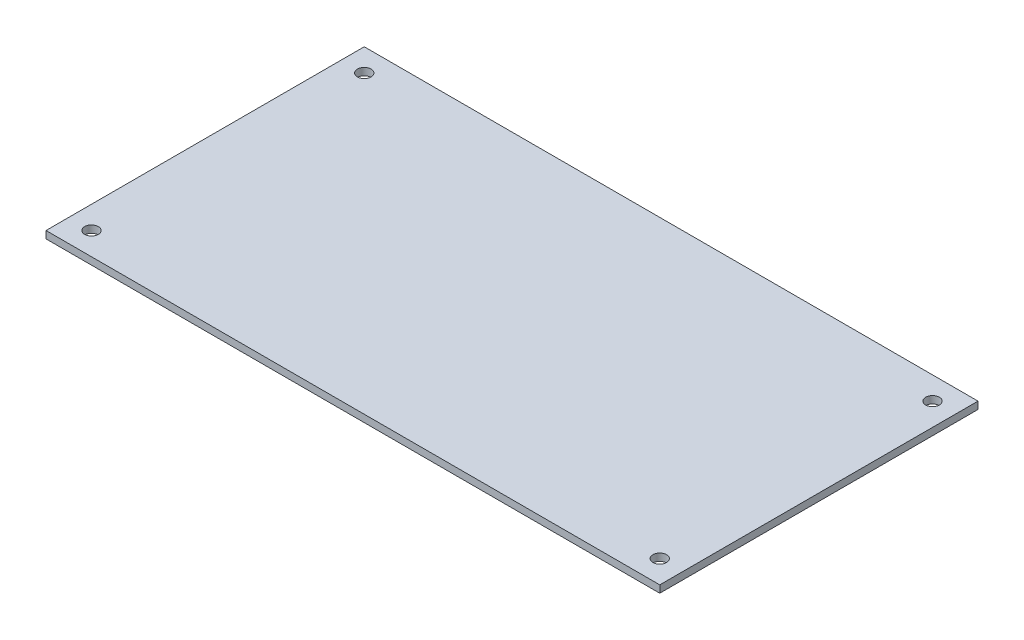
ISO-10303-21;
HEADER;
FILE_DESCRIPTION(('STEP AP214'),'2;1');
FILE_NAME('part.step','',(''),(''),'','','');
FILE_SCHEMA(('AUTOMOTIVE_DESIGN { 1 0 10303 214 1 1 1 1 }'));
ENDSEC;
DATA;
#1=APPLICATION_CONTEXT('core data for automotive mechanical design processes');
#2=APPLICATION_PROTOCOL_DEFINITION('international standard','automotive_design',2000,#1);
#3=PRODUCT_CONTEXT('',#1,'mechanical');
#4=PRODUCT('Part','Part','',(#3));
#5=PRODUCT_RELATED_PRODUCT_CATEGORY('part','',(#4));
#6=PRODUCT_DEFINITION_FORMATION('','',#4);
#7=PRODUCT_DEFINITION_CONTEXT('part definition',#1,'design');
#8=PRODUCT_DEFINITION('design','',#6,#7);
#9=PRODUCT_DEFINITION_SHAPE('','',#8);
#10=(LENGTH_UNIT() NAMED_UNIT(*) SI_UNIT(.MILLI.,.METRE.));
#11=(NAMED_UNIT(*) PLANE_ANGLE_UNIT() SI_UNIT($,.RADIAN.));
#12=(NAMED_UNIT(*) SI_UNIT($,.STERADIAN.) SOLID_ANGLE_UNIT());
#13=UNCERTAINTY_MEASURE_WITH_UNIT(LENGTH_MEASURE(1.E-05),#10,'distance_accuracy_value','');
#14=(GEOMETRIC_REPRESENTATION_CONTEXT(3) GLOBAL_UNCERTAINTY_ASSIGNED_CONTEXT((#13)) GLOBAL_UNIT_ASSIGNED_CONTEXT((#10,
#11,#12)) REPRESENTATION_CONTEXT('',''));
#15=CARTESIAN_POINT('',(0.,0.,0.));
#16=DIRECTION('',(0.,0.,1.));
#17=DIRECTION('',(1.,0.,0.));
#18=AXIS2_PLACEMENT_3D('',#15,#16,#17);
#19=CARTESIAN_POINT('',(67.5,1.6,35.));
#20=DIRECTION('',(-1.,0.,0.));
#21=DIRECTION('',(0.,0.,1.));
#22=AXIS2_PLACEMENT_3D('',#19,#20,#21);
#23=PLANE('',#22);
#24=DIRECTION('',(0.,0.,-1.));
#25=VECTOR('',#24,1.);
#26=CARTESIAN_POINT('',(67.5,0.,35.));
#27=LINE('',#26,#25);
#28=CARTESIAN_POINT('',(67.5,0.,35.));
#29=VERTEX_POINT('',#28);
#30=CARTESIAN_POINT('',(67.5,0.,-35.));
#31=VERTEX_POINT('',#30);
#32=EDGE_CURVE('E107',#29,#31,#27,.T.);
#33=ORIENTED_EDGE('',*,*,#32,.T.);
#34=DIRECTION('',(0.,-1.,0.));
#35=VECTOR('',#34,1.);
#36=CARTESIAN_POINT('',(67.5,1.6,-35.));
#37=LINE('',#36,#35);
#38=CARTESIAN_POINT('',(67.5,1.6,-35.));
#39=VERTEX_POINT('',#38);
#40=EDGE_CURVE('E11',#39,#31,#37,.T.);
#41=ORIENTED_EDGE('',*,*,#40,.F.);
#42=DIRECTION('',(0.,0.,-1.));
#43=VECTOR('',#42,1.);
#44=CARTESIAN_POINT('',(67.5,1.6,35.));
#45=LINE('',#44,#43);
#46=CARTESIAN_POINT('',(67.5,1.6,35.));
#47=VERTEX_POINT('',#46);
#48=EDGE_CURVE('E91',#47,#39,#45,.T.);
#49=ORIENTED_EDGE('',*,*,#48,.F.);
#50=DIRECTION('',(0.,-1.,0.));
#51=VECTOR('',#50,1.);
#52=CARTESIAN_POINT('',(67.5,1.6,35.));
#53=LINE('',#52,#51);
#54=EDGE_CURVE('E103',#47,#29,#53,.T.);
#55=ORIENTED_EDGE('',*,*,#54,.T.);
#56=EDGE_LOOP('',(#33,#41,#49,#55));
#57=FACE_BOUND('',#56,.T.);
#58=ADVANCED_FACE('F39',(#57),#23,.F.);
#59=CARTESIAN_POINT('',(-67.5,1.6,-35.));
#60=DIRECTION('',(0.,0.,1.));
#61=DIRECTION('',(1.,0.,0.));
#62=AXIS2_PLACEMENT_3D('',#59,#60,#61);
#63=PLANE('',#62);
#64=DIRECTION('',(-1.,0.,0.));
#65=VECTOR('',#64,1.);
#66=CARTESIAN_POINT('',(-67.5,0.,-35.));
#67=LINE('',#66,#65);
#68=CARTESIAN_POINT('',(-67.5,0.,-35.));
#69=VERTEX_POINT('',#68);
#70=EDGE_CURVE('E96',#31,#69,#67,.T.);
#71=ORIENTED_EDGE('',*,*,#70,.T.);
#72=DIRECTION('',(0.,-1.,0.));
#73=VECTOR('',#72,1.);
#74=CARTESIAN_POINT('',(-67.5,1.6,-35.));
#75=LINE('',#74,#73);
#76=CARTESIAN_POINT('',(-67.5,1.6,-35.));
#77=VERTEX_POINT('',#76);
#78=EDGE_CURVE('E48',#77,#69,#75,.T.);
#79=ORIENTED_EDGE('',*,*,#78,.F.);
#80=DIRECTION('',(-1.,0.,0.));
#81=VECTOR('',#80,1.);
#82=CARTESIAN_POINT('',(-67.5,1.6,-35.));
#83=LINE('',#82,#81);
#84=EDGE_CURVE('E86',#39,#77,#83,.T.);
#85=ORIENTED_EDGE('',*,*,#84,.F.);
#86=ORIENTED_EDGE('',*,*,#40,.T.);
#87=EDGE_LOOP('',(#71,#79,#85,#86));
#88=FACE_BOUND('',#87,.T.);
#89=ADVANCED_FACE('F95',(#88),#63,.F.);
#90=CARTESIAN_POINT('',(-67.5,1.6,35.));
#91=DIRECTION('',(1.,0.,0.));
#92=DIRECTION('',(0.,0.,-1.));
#93=AXIS2_PLACEMENT_3D('',#90,#91,#92);
#94=PLANE('',#93);
#95=DIRECTION('',(0.,0.,1.));
#96=VECTOR('',#95,1.);
#97=CARTESIAN_POINT('',(-67.5,0.,35.));
#98=LINE('',#97,#96);
#99=CARTESIAN_POINT('',(-67.5,0.,35.));
#100=VERTEX_POINT('',#99);
#101=EDGE_CURVE('E73',#69,#100,#98,.T.);
#102=ORIENTED_EDGE('',*,*,#101,.T.);
#103=DIRECTION('',(0.,-1.,0.));
#104=VECTOR('',#103,1.);
#105=CARTESIAN_POINT('',(-67.5,1.6,35.));
#106=LINE('',#105,#104);
#107=CARTESIAN_POINT('',(-67.5,1.6,35.));
#108=VERTEX_POINT('',#107);
#109=EDGE_CURVE('E98',#108,#100,#106,.T.);
#110=ORIENTED_EDGE('',*,*,#109,.F.);
#111=DIRECTION('',(0.,0.,1.));
#112=VECTOR('',#111,1.);
#113=CARTESIAN_POINT('',(-67.5,1.6,35.));
#114=LINE('',#113,#112);
#115=EDGE_CURVE('E89',#77,#108,#114,.T.);
#116=ORIENTED_EDGE('',*,*,#115,.F.);
#117=ORIENTED_EDGE('',*,*,#78,.T.);
#118=EDGE_LOOP('',(#102,#110,#116,#117));
#119=FACE_BOUND('',#118,.T.);
#120=ADVANCED_FACE('F99',(#119),#94,.F.);
#121=CARTESIAN_POINT('',(-67.5,1.6,35.));
#122=DIRECTION('',(0.,0.,-1.));
#123=DIRECTION('',(-1.,0.,0.));
#124=AXIS2_PLACEMENT_3D('',#121,#122,#123);
#125=PLANE('',#124);
#126=DIRECTION('',(1.,0.,0.));
#127=VECTOR('',#126,1.);
#128=CARTESIAN_POINT('',(-67.5,0.,35.));
#129=LINE('',#128,#127);
#130=EDGE_CURVE('E79',#100,#29,#129,.T.);
#131=ORIENTED_EDGE('',*,*,#130,.T.);
#132=ORIENTED_EDGE('',*,*,#54,.F.);
#133=DIRECTION('',(1.,0.,0.));
#134=VECTOR('',#133,1.);
#135=CARTESIAN_POINT('',(-67.5,1.6,35.));
#136=LINE('',#135,#134);
#137=EDGE_CURVE('E56',#108,#47,#136,.T.);
#138=ORIENTED_EDGE('',*,*,#137,.F.);
#139=ORIENTED_EDGE('',*,*,#109,.T.);
#140=EDGE_LOOP('',(#131,#132,#138,#139));
#141=FACE_BOUND('',#140,.T.);
#142=ADVANCED_FACE('F121',(#141),#125,.F.);
#143=CARTESIAN_POINT('',(0.,1.6,0.));
#144=DIRECTION('',(0.,-1.,0.));
#145=DIRECTION('',(0.,0.,-1.));
#146=AXIS2_PLACEMENT_3D('',#143,#144,#145);
#147=PLANE('',#146);
#148=CARTESIAN_POINT('',(-62.5,1.6,30.));
#149=DIRECTION('',(0.,-1.,0.));
#150=DIRECTION('',(0.,0.,-1.));
#151=AXIS2_PLACEMENT_3D('',#148,#149,#150);
#152=CIRCLE('',#151,1.5);
#153=CARTESIAN_POINT('',(-62.5,1.6,28.5));
#154=VERTEX_POINT('',#153);
#155=EDGE_CURVE('E111',#154,#154,#152,.F.);
#156=ORIENTED_EDGE('',*,*,#155,.F.);
#157=EDGE_LOOP('',(#156));
#158=FACE_BOUND('',#157,.T.);
#159=CARTESIAN_POINT('',(62.5,1.6,30.));
#160=DIRECTION('',(0.,-1.,0.));
#161=DIRECTION('',(0.,0.,-1.));
#162=AXIS2_PLACEMENT_3D('',#159,#160,#161);
#163=CIRCLE('',#162,1.5);
#164=CARTESIAN_POINT('',(62.5,1.6,28.5));
#165=VERTEX_POINT('',#164);
#166=EDGE_CURVE('E131',#165,#165,#163,.F.);
#167=ORIENTED_EDGE('',*,*,#166,.F.);
#168=EDGE_LOOP('',(#167));
#169=FACE_BOUND('',#168,.T.);
#170=CARTESIAN_POINT('',(62.5,1.6,-30.));
#171=DIRECTION('',(0.,-1.,0.));
#172=DIRECTION('',(0.,0.,-1.));
#173=AXIS2_PLACEMENT_3D('',#170,#171,#172);
#174=CIRCLE('',#173,1.5);
#175=CARTESIAN_POINT('',(62.5,1.6,-31.5));
#176=VERTEX_POINT('',#175);
#177=EDGE_CURVE('E135',#176,#176,#174,.F.);
#178=ORIENTED_EDGE('',*,*,#177,.F.);
#179=EDGE_LOOP('',(#178));
#180=FACE_BOUND('',#179,.T.);
#181=CARTESIAN_POINT('',(-62.5,1.6,-30.));
#182=DIRECTION('',(0.,-1.,0.));
#183=DIRECTION('',(0.,0.,-1.));
#184=AXIS2_PLACEMENT_3D('',#181,#182,#183);
#185=CIRCLE('',#184,1.5);
#186=CARTESIAN_POINT('',(-62.5,1.6,-31.5));
#187=VERTEX_POINT('',#186);
#188=EDGE_CURVE('E139',#187,#187,#185,.F.);
#189=ORIENTED_EDGE('',*,*,#188,.F.);
#190=EDGE_LOOP('',(#189));
#191=FACE_BOUND('',#190,.T.);
#192=ORIENTED_EDGE('',*,*,#48,.T.);
#193=ORIENTED_EDGE('',*,*,#84,.T.);
#194=ORIENTED_EDGE('',*,*,#115,.T.);
#195=ORIENTED_EDGE('',*,*,#137,.T.);
#196=EDGE_LOOP('',(#192,#193,#194,#195));
#197=FACE_BOUND('',#196,.T.);
#198=ADVANCED_FACE('F87',(#158,#169,#180,#191,#197),#147,.F.);
#199=CARTESIAN_POINT('',(0.,0.,0.));
#200=DIRECTION('',(0.,-1.,0.));
#201=DIRECTION('',(0.,0.,-1.));
#202=AXIS2_PLACEMENT_3D('',#199,#200,#201);
#203=PLANE('',#202);
#204=CARTESIAN_POINT('',(-62.5,0.,30.));
#205=DIRECTION('',(0.,-1.,0.));
#206=DIRECTION('',(0.,0.,-1.));
#207=AXIS2_PLACEMENT_3D('',#204,#205,#206);
#208=CIRCLE('',#207,1.5);
#209=CARTESIAN_POINT('',(-62.5,0.,28.5));
#210=VERTEX_POINT('',#209);
#211=EDGE_CURVE('E148',#210,#210,#208,.F.);
#212=ORIENTED_EDGE('',*,*,#211,.T.);
#213=EDGE_LOOP('',(#212));
#214=FACE_BOUND('',#213,.T.);
#215=CARTESIAN_POINT('',(62.5,0.,30.));
#216=DIRECTION('',(0.,-1.,0.));
#217=DIRECTION('',(0.,0.,-1.));
#218=AXIS2_PLACEMENT_3D('',#215,#216,#217);
#219=CIRCLE('',#218,1.5);
#220=CARTESIAN_POINT('',(62.5,0.,28.5));
#221=VERTEX_POINT('',#220);
#222=EDGE_CURVE('E152',#221,#221,#219,.F.);
#223=ORIENTED_EDGE('',*,*,#222,.T.);
#224=EDGE_LOOP('',(#223));
#225=FACE_BOUND('',#224,.T.);
#226=CARTESIAN_POINT('',(62.5,0.,-30.));
#227=DIRECTION('',(0.,-1.,0.));
#228=DIRECTION('',(0.,0.,-1.));
#229=AXIS2_PLACEMENT_3D('',#226,#227,#228);
#230=CIRCLE('',#229,1.5);
#231=CARTESIAN_POINT('',(62.5,0.,-31.5));
#232=VERTEX_POINT('',#231);
#233=EDGE_CURVE('E147',#232,#232,#230,.F.);
#234=ORIENTED_EDGE('',*,*,#233,.T.);
#235=EDGE_LOOP('',(#234));
#236=FACE_BOUND('',#235,.T.);
#237=CARTESIAN_POINT('',(-62.5,0.,-30.));
#238=DIRECTION('',(0.,-1.,0.));
#239=DIRECTION('',(0.,0.,-1.));
#240=AXIS2_PLACEMENT_3D('',#237,#238,#239);
#241=CIRCLE('',#240,1.5);
#242=CARTESIAN_POINT('',(-62.5,0.,-31.5));
#243=VERTEX_POINT('',#242);
#244=EDGE_CURVE('E143',#243,#243,#241,.F.);
#245=ORIENTED_EDGE('',*,*,#244,.T.);
#246=EDGE_LOOP('',(#245));
#247=FACE_BOUND('',#246,.T.);
#248=ORIENTED_EDGE('',*,*,#32,.F.);
#249=ORIENTED_EDGE('',*,*,#130,.F.);
#250=ORIENTED_EDGE('',*,*,#101,.F.);
#251=ORIENTED_EDGE('',*,*,#70,.F.);
#252=EDGE_LOOP('',(#248,#249,#250,#251));
#253=FACE_BOUND('',#252,.T.);
#254=ADVANCED_FACE('F124',(#214,#225,#236,#247,#253),#203,.T.);
#255=CARTESIAN_POINT('',(-62.5,1.600012,-30.));
#256=DIRECTION('',(0.,-1.,0.));
#257=DIRECTION('',(0.,0.,-1.));
#258=AXIS2_PLACEMENT_3D('',#255,#256,#257);
#259=CYLINDRICAL_SURFACE('',#258,1.5);
#260=CARTESIAN_POINT('',(-62.5,0.,-31.5));
#261=CARTESIAN_POINT('',(-62.5,0.0166666666666669,-31.5));
#262=CARTESIAN_POINT('',(-62.5,0.0333333333333335,-31.5));
#263=CARTESIAN_POINT('',(-62.5,0.0666666666666668,-31.5));
#264=CARTESIAN_POINT('',(-62.5,0.0833333333333336,-31.5));
#265=CARTESIAN_POINT('',(-62.5,0.116666666666667,-31.5));
#266=CARTESIAN_POINT('',(-62.5,0.133333333333334,-31.5));
#267=CARTESIAN_POINT('',(-62.5,0.166666666666667,-31.5));
#268=CARTESIAN_POINT('',(-62.5,0.183333333333334,-31.5));
#269=CARTESIAN_POINT('',(-62.5,0.216666666666667,-31.5));
#270=CARTESIAN_POINT('',(-62.5,0.233333333333334,-31.5));
#271=CARTESIAN_POINT('',(-62.5,0.266666666666667,-31.5));
#272=CARTESIAN_POINT('',(-62.5,0.283333333333333,-31.5));
#273=CARTESIAN_POINT('',(-62.5,0.316666666666667,-31.5));
#274=CARTESIAN_POINT('',(-62.5,0.333333333333334,-31.5));
#275=CARTESIAN_POINT('',(-62.5,0.366666666666667,-31.5));
#276=CARTESIAN_POINT('',(-62.5,0.383333333333334,-31.5));
#277=CARTESIAN_POINT('',(-62.5,0.416666666666667,-31.5));
#278=CARTESIAN_POINT('',(-62.5,0.433333333333334,-31.5));
#279=CARTESIAN_POINT('',(-62.5,0.466666666666667,-31.5));
#280=CARTESIAN_POINT('',(-62.5,0.483333333333334,-31.5));
#281=CARTESIAN_POINT('',(-62.5,0.516666666666667,-31.5));
#282=CARTESIAN_POINT('',(-62.5,0.533333333333334,-31.5));
#283=CARTESIAN_POINT('',(-62.5,0.566666666666667,-31.5));
#284=CARTESIAN_POINT('',(-62.5,0.583333333333334,-31.5));
#285=CARTESIAN_POINT('',(-62.5,0.616666666666667,-31.5));
#286=CARTESIAN_POINT('',(-62.5,0.633333333333334,-31.5));
#287=CARTESIAN_POINT('',(-62.5,0.666666666666667,-31.5));
#288=CARTESIAN_POINT('',(-62.5,0.683333333333333,-31.5));
#289=CARTESIAN_POINT('',(-62.5,0.716666666666667,-31.5));
#290=CARTESIAN_POINT('',(-62.5,0.733333333333334,-31.5));
#291=CARTESIAN_POINT('',(-62.5,0.766666666666667,-31.5));
#292=CARTESIAN_POINT('',(-62.5,0.783333333333333,-31.5));
#293=CARTESIAN_POINT('',(-62.5,0.816666666666667,-31.5));
#294=CARTESIAN_POINT('',(-62.5,0.833333333333333,-31.5));
#295=CARTESIAN_POINT('',(-62.5,0.866666666666667,-31.5));
#296=CARTESIAN_POINT('',(-62.5,0.883333333333334,-31.5));
#297=CARTESIAN_POINT('',(-62.5,0.916666666666667,-31.5));
#298=CARTESIAN_POINT('',(-62.5,0.933333333333333,-31.5));
#299=CARTESIAN_POINT('',(-62.5,0.966666666666667,-31.5));
#300=CARTESIAN_POINT('',(-62.5,0.983333333333334,-31.5));
#301=CARTESIAN_POINT('',(-62.5,1.01666666666667,-31.5));
#302=CARTESIAN_POINT('',(-62.5,1.03333333333333,-31.5));
#303=CARTESIAN_POINT('',(-62.5,1.06666666666667,-31.5));
#304=CARTESIAN_POINT('',(-62.5,1.08333333333333,-31.5));
#305=CARTESIAN_POINT('',(-62.5,1.11666666666667,-31.5));
#306=CARTESIAN_POINT('',(-62.5,1.13333333333333,-31.5));
#307=CARTESIAN_POINT('',(-62.5,1.16666666666667,-31.5));
#308=CARTESIAN_POINT('',(-62.5,1.18333333333333,-31.5));
#309=CARTESIAN_POINT('',(-62.5,1.21666666666667,-31.5));
#310=CARTESIAN_POINT('',(-62.5,1.23333333333333,-31.5));
#311=CARTESIAN_POINT('',(-62.5,1.26666666666667,-31.5));
#312=CARTESIAN_POINT('',(-62.5,1.28333333333333,-31.5));
#313=CARTESIAN_POINT('',(-62.5,1.31666666666667,-31.5));
#314=CARTESIAN_POINT('',(-62.5,1.33333333333333,-31.5));
#315=CARTESIAN_POINT('',(-62.5,1.36666666666667,-31.5));
#316=CARTESIAN_POINT('',(-62.5,1.38333333333333,-31.5));
#317=CARTESIAN_POINT('',(-62.5,1.41666666666667,-31.5));
#318=CARTESIAN_POINT('',(-62.5,1.43333333333333,-31.5));
#319=CARTESIAN_POINT('',(-62.5,1.46666666666667,-31.5));
#320=CARTESIAN_POINT('',(-62.5,1.48333333333333,-31.5));
#321=CARTESIAN_POINT('',(-62.5,1.51666666666667,-31.5));
#322=CARTESIAN_POINT('',(-62.5,1.53333333333333,-31.5));
#323=CARTESIAN_POINT('',(-62.5,1.56666666666667,-31.5));
#324=CARTESIAN_POINT('',(-62.5,1.58333333333333,-31.5));
#325=CARTESIAN_POINT('',(-62.5,1.6,-31.5));
#326=B_SPLINE_CURVE_WITH_KNOTS('',3,(#260,#261,#262,#263,#264,#265,#266,#267,#268,#269,#270,
#271,#272,#273,#274,#275,#276,#277,#278,#279,#280,#281,#282,#283,#284,#285,#286,#287,#288,#289,
#290,#291,#292,#293,#294,#295,#296,#297,#298,#299,#300,#301,#302,#303,#304,#305,#306,#307,#308,
#309,#310,#311,#312,#313,#314,#315,#316,#317,#318,#319,#320,#321,#322,#323,#324,#325),
.UNSPECIFIED.,.F.,.F.,(4,2,2,2,2,2,2,2,2,2,2,2,2,2,2,2,2,2,2,2,2,2,2,2,2,2,2,2,2,2,2,2,4),(0.,
0.0499999999999999,0.1,0.15,0.2,0.25,0.3,0.35,0.4,0.45,0.5,0.55,0.6,0.65,0.7,0.75,0.8,0.85,0.9,
0.95,1.,1.05,1.1,1.15,1.2,1.25,1.3,1.35,1.4,1.45,1.5,1.55,1.6),.UNSPECIFIED.);
#327=EDGE_CURVE('BSEAM166',#243,#187,#326,.T.);
#328=ORIENTED_EDGE('',*,*,#244,.F.);
#329=ORIENTED_EDGE('',*,*,#188,.T.);
#330=ORIENTED_EDGE('',*,*,#327,.T.);
#331=ORIENTED_EDGE('',*,*,#327,.F.);
#332=EDGE_LOOP('',(#328,#330,#329,#331));
#333=FACE_BOUND('',#332,.T.);
#334=ADVANCED_FACE('F166',(#333),#259,.F.);
#335=CARTESIAN_POINT('',(62.5,1.600012,-30.));
#336=DIRECTION('',(0.,-1.,0.));
#337=DIRECTION('',(0.,0.,-1.));
#338=AXIS2_PLACEMENT_3D('',#335,#336,#337);
#339=CYLINDRICAL_SURFACE('',#338,1.5);
#340=CARTESIAN_POINT('',(62.5,0.,-31.5));
#341=CARTESIAN_POINT('',(62.5,0.0166666666666669,-31.5));
#342=CARTESIAN_POINT('',(62.5,0.0333333333333335,-31.5));
#343=CARTESIAN_POINT('',(62.5,0.0666666666666668,-31.5));
#344=CARTESIAN_POINT('',(62.5,0.0833333333333336,-31.5));
#345=CARTESIAN_POINT('',(62.5,0.116666666666667,-31.5));
#346=CARTESIAN_POINT('',(62.5,0.133333333333334,-31.5));
#347=CARTESIAN_POINT('',(62.5,0.166666666666667,-31.5));
#348=CARTESIAN_POINT('',(62.5,0.183333333333334,-31.5));
#349=CARTESIAN_POINT('',(62.5,0.216666666666667,-31.5));
#350=CARTESIAN_POINT('',(62.5,0.233333333333334,-31.5));
#351=CARTESIAN_POINT('',(62.5,0.266666666666667,-31.5));
#352=CARTESIAN_POINT('',(62.5,0.283333333333333,-31.5));
#353=CARTESIAN_POINT('',(62.5,0.316666666666667,-31.5));
#354=CARTESIAN_POINT('',(62.5,0.333333333333334,-31.5));
#355=CARTESIAN_POINT('',(62.5,0.366666666666667,-31.5));
#356=CARTESIAN_POINT('',(62.5,0.383333333333334,-31.5));
#357=CARTESIAN_POINT('',(62.5,0.416666666666667,-31.5));
#358=CARTESIAN_POINT('',(62.5,0.433333333333334,-31.5));
#359=CARTESIAN_POINT('',(62.5,0.466666666666667,-31.5));
#360=CARTESIAN_POINT('',(62.5,0.483333333333334,-31.5));
#361=CARTESIAN_POINT('',(62.5,0.516666666666667,-31.5));
#362=CARTESIAN_POINT('',(62.5,0.533333333333334,-31.5));
#363=CARTESIAN_POINT('',(62.5,0.566666666666667,-31.5));
#364=CARTESIAN_POINT('',(62.5,0.583333333333334,-31.5));
#365=CARTESIAN_POINT('',(62.5,0.616666666666667,-31.5));
#366=CARTESIAN_POINT('',(62.5,0.633333333333334,-31.5));
#367=CARTESIAN_POINT('',(62.5,0.666666666666667,-31.5));
#368=CARTESIAN_POINT('',(62.5,0.683333333333333,-31.5));
#369=CARTESIAN_POINT('',(62.5,0.716666666666667,-31.5));
#370=CARTESIAN_POINT('',(62.5,0.733333333333334,-31.5));
#371=CARTESIAN_POINT('',(62.5,0.766666666666667,-31.5));
#372=CARTESIAN_POINT('',(62.5,0.783333333333333,-31.5));
#373=CARTESIAN_POINT('',(62.5,0.816666666666667,-31.5));
#374=CARTESIAN_POINT('',(62.5,0.833333333333333,-31.5));
#375=CARTESIAN_POINT('',(62.5,0.866666666666667,-31.5));
#376=CARTESIAN_POINT('',(62.5,0.883333333333334,-31.5));
#377=CARTESIAN_POINT('',(62.5,0.916666666666667,-31.5));
#378=CARTESIAN_POINT('',(62.5,0.933333333333333,-31.5));
#379=CARTESIAN_POINT('',(62.5,0.966666666666667,-31.5));
#380=CARTESIAN_POINT('',(62.5,0.983333333333334,-31.5));
#381=CARTESIAN_POINT('',(62.5,1.01666666666667,-31.5));
#382=CARTESIAN_POINT('',(62.5,1.03333333333333,-31.5));
#383=CARTESIAN_POINT('',(62.5,1.06666666666667,-31.5));
#384=CARTESIAN_POINT('',(62.5,1.08333333333333,-31.5));
#385=CARTESIAN_POINT('',(62.5,1.11666666666667,-31.5));
#386=CARTESIAN_POINT('',(62.5,1.13333333333333,-31.5));
#387=CARTESIAN_POINT('',(62.5,1.16666666666667,-31.5));
#388=CARTESIAN_POINT('',(62.5,1.18333333333333,-31.5));
#389=CARTESIAN_POINT('',(62.5,1.21666666666667,-31.5));
#390=CARTESIAN_POINT('',(62.5,1.23333333333333,-31.5));
#391=CARTESIAN_POINT('',(62.5,1.26666666666667,-31.5));
#392=CARTESIAN_POINT('',(62.5,1.28333333333333,-31.5));
#393=CARTESIAN_POINT('',(62.5,1.31666666666667,-31.5));
#394=CARTESIAN_POINT('',(62.5,1.33333333333333,-31.5));
#395=CARTESIAN_POINT('',(62.5,1.36666666666667,-31.5));
#396=CARTESIAN_POINT('',(62.5,1.38333333333333,-31.5));
#397=CARTESIAN_POINT('',(62.5,1.41666666666667,-31.5));
#398=CARTESIAN_POINT('',(62.5,1.43333333333333,-31.5));
#399=CARTESIAN_POINT('',(62.5,1.46666666666667,-31.5));
#400=CARTESIAN_POINT('',(62.5,1.48333333333333,-31.5));
#401=CARTESIAN_POINT('',(62.5,1.51666666666667,-31.5));
#402=CARTESIAN_POINT('',(62.5,1.53333333333333,-31.5));
#403=CARTESIAN_POINT('',(62.5,1.56666666666667,-31.5));
#404=CARTESIAN_POINT('',(62.5,1.58333333333333,-31.5));
#405=CARTESIAN_POINT('',(62.5,1.6,-31.5));
#406=B_SPLINE_CURVE_WITH_KNOTS('',3,(#340,#341,#342,#343,#344,#345,#346,#347,#348,#349,#350,
#351,#352,#353,#354,#355,#356,#357,#358,#359,#360,#361,#362,#363,#364,#365,#366,#367,#368,#369,
#370,#371,#372,#373,#374,#375,#376,#377,#378,#379,#380,#381,#382,#383,#384,#385,#386,#387,#388,
#389,#390,#391,#392,#393,#394,#395,#396,#397,#398,#399,#400,#401,#402,#403,#404,#405),
.UNSPECIFIED.,.F.,.F.,(4,2,2,2,2,2,2,2,2,2,2,2,2,2,2,2,2,2,2,2,2,2,2,2,2,2,2,2,2,2,2,2,4),(0.,
0.0499999999999999,0.1,0.15,0.2,0.25,0.3,0.35,0.4,0.45,0.5,0.55,0.6,0.65,0.7,0.75,0.8,0.85,0.9,
0.95,1.,1.05,1.1,1.15,1.2,1.25,1.3,1.35,1.4,1.45,1.5,1.55,1.6),.UNSPECIFIED.);
#407=EDGE_CURVE('BSEAM162',#232,#176,#406,.T.);
#408=ORIENTED_EDGE('',*,*,#233,.F.);
#409=ORIENTED_EDGE('',*,*,#177,.T.);
#410=ORIENTED_EDGE('',*,*,#407,.T.);
#411=ORIENTED_EDGE('',*,*,#407,.F.);
#412=EDGE_LOOP('',(#408,#410,#409,#411));
#413=FACE_BOUND('',#412,.T.);
#414=ADVANCED_FACE('F162',(#413),#339,.F.);
#415=CARTESIAN_POINT('',(62.5,1.600012,30.));
#416=DIRECTION('',(0.,-1.,0.));
#417=DIRECTION('',(0.,0.,-1.));
#418=AXIS2_PLACEMENT_3D('',#415,#416,#417);
#419=CYLINDRICAL_SURFACE('',#418,1.5);
#420=CARTESIAN_POINT('',(62.5,0.,28.5));
#421=CARTESIAN_POINT('',(62.5,0.0166666666666669,28.5));
#422=CARTESIAN_POINT('',(62.5,0.0333333333333335,28.5));
#423=CARTESIAN_POINT('',(62.5,0.0666666666666668,28.5));
#424=CARTESIAN_POINT('',(62.5,0.0833333333333336,28.5));
#425=CARTESIAN_POINT('',(62.5,0.116666666666667,28.5));
#426=CARTESIAN_POINT('',(62.5,0.133333333333334,28.5));
#427=CARTESIAN_POINT('',(62.5,0.166666666666667,28.5));
#428=CARTESIAN_POINT('',(62.5,0.183333333333334,28.5));
#429=CARTESIAN_POINT('',(62.5,0.216666666666667,28.5));
#430=CARTESIAN_POINT('',(62.5,0.233333333333334,28.5));
#431=CARTESIAN_POINT('',(62.5,0.266666666666667,28.5));
#432=CARTESIAN_POINT('',(62.5,0.283333333333333,28.5));
#433=CARTESIAN_POINT('',(62.5,0.316666666666667,28.5));
#434=CARTESIAN_POINT('',(62.5,0.333333333333334,28.5));
#435=CARTESIAN_POINT('',(62.5,0.366666666666667,28.5));
#436=CARTESIAN_POINT('',(62.5,0.383333333333334,28.5));
#437=CARTESIAN_POINT('',(62.5,0.416666666666667,28.5));
#438=CARTESIAN_POINT('',(62.5,0.433333333333334,28.5));
#439=CARTESIAN_POINT('',(62.5,0.466666666666667,28.5));
#440=CARTESIAN_POINT('',(62.5,0.483333333333334,28.5));
#441=CARTESIAN_POINT('',(62.5,0.516666666666667,28.5));
#442=CARTESIAN_POINT('',(62.5,0.533333333333334,28.5));
#443=CARTESIAN_POINT('',(62.5,0.566666666666667,28.5));
#444=CARTESIAN_POINT('',(62.5,0.583333333333334,28.5));
#445=CARTESIAN_POINT('',(62.5,0.616666666666667,28.5));
#446=CARTESIAN_POINT('',(62.5,0.633333333333334,28.5));
#447=CARTESIAN_POINT('',(62.5,0.666666666666667,28.5));
#448=CARTESIAN_POINT('',(62.5,0.683333333333333,28.5));
#449=CARTESIAN_POINT('',(62.5,0.716666666666667,28.5));
#450=CARTESIAN_POINT('',(62.5,0.733333333333334,28.5));
#451=CARTESIAN_POINT('',(62.5,0.766666666666667,28.5));
#452=CARTESIAN_POINT('',(62.5,0.783333333333333,28.5));
#453=CARTESIAN_POINT('',(62.5,0.816666666666667,28.5));
#454=CARTESIAN_POINT('',(62.5,0.833333333333333,28.5));
#455=CARTESIAN_POINT('',(62.5,0.866666666666667,28.5));
#456=CARTESIAN_POINT('',(62.5,0.883333333333334,28.5));
#457=CARTESIAN_POINT('',(62.5,0.916666666666667,28.5));
#458=CARTESIAN_POINT('',(62.5,0.933333333333333,28.5));
#459=CARTESIAN_POINT('',(62.5,0.966666666666667,28.5));
#460=CARTESIAN_POINT('',(62.5,0.983333333333334,28.5));
#461=CARTESIAN_POINT('',(62.5,1.01666666666667,28.5));
#462=CARTESIAN_POINT('',(62.5,1.03333333333333,28.5));
#463=CARTESIAN_POINT('',(62.5,1.06666666666667,28.5));
#464=CARTESIAN_POINT('',(62.5,1.08333333333333,28.5));
#465=CARTESIAN_POINT('',(62.5,1.11666666666667,28.5));
#466=CARTESIAN_POINT('',(62.5,1.13333333333333,28.5));
#467=CARTESIAN_POINT('',(62.5,1.16666666666667,28.5));
#468=CARTESIAN_POINT('',(62.5,1.18333333333333,28.5));
#469=CARTESIAN_POINT('',(62.5,1.21666666666667,28.5));
#470=CARTESIAN_POINT('',(62.5,1.23333333333333,28.5));
#471=CARTESIAN_POINT('',(62.5,1.26666666666667,28.5));
#472=CARTESIAN_POINT('',(62.5,1.28333333333333,28.5));
#473=CARTESIAN_POINT('',(62.5,1.31666666666667,28.5));
#474=CARTESIAN_POINT('',(62.5,1.33333333333333,28.5));
#475=CARTESIAN_POINT('',(62.5,1.36666666666667,28.5));
#476=CARTESIAN_POINT('',(62.5,1.38333333333333,28.5));
#477=CARTESIAN_POINT('',(62.5,1.41666666666667,28.5));
#478=CARTESIAN_POINT('',(62.5,1.43333333333333,28.5));
#479=CARTESIAN_POINT('',(62.5,1.46666666666667,28.5));
#480=CARTESIAN_POINT('',(62.5,1.48333333333333,28.5));
#481=CARTESIAN_POINT('',(62.5,1.51666666666667,28.5));
#482=CARTESIAN_POINT('',(62.5,1.53333333333333,28.5));
#483=CARTESIAN_POINT('',(62.5,1.56666666666667,28.5));
#484=CARTESIAN_POINT('',(62.5,1.58333333333333,28.5));
#485=CARTESIAN_POINT('',(62.5,1.6,28.5));
#486=B_SPLINE_CURVE_WITH_KNOTS('',3,(#420,#421,#422,#423,#424,#425,#426,#427,#428,#429,#430,
#431,#432,#433,#434,#435,#436,#437,#438,#439,#440,#441,#442,#443,#444,#445,#446,#447,#448,#449,
#450,#451,#452,#453,#454,#455,#456,#457,#458,#459,#460,#461,#462,#463,#464,#465,#466,#467,#468,
#469,#470,#471,#472,#473,#474,#475,#476,#477,#478,#479,#480,#481,#482,#483,#484,#485),
.UNSPECIFIED.,.F.,.F.,(4,2,2,2,2,2,2,2,2,2,2,2,2,2,2,2,2,2,2,2,2,2,2,2,2,2,2,2,2,2,2,2,4),(0.,
0.0499999999999999,0.1,0.15,0.2,0.25,0.3,0.35,0.4,0.45,0.5,0.55,0.6,0.65,0.7,0.75,0.8,0.85,0.9,
0.95,1.,1.05,1.1,1.15,1.2,1.25,1.3,1.35,1.4,1.45,1.5,1.55,1.6),.UNSPECIFIED.);
#487=EDGE_CURVE('BSEAM165',#221,#165,#486,.T.);
#488=ORIENTED_EDGE('',*,*,#222,.F.);
#489=ORIENTED_EDGE('',*,*,#166,.T.);
#490=ORIENTED_EDGE('',*,*,#487,.T.);
#491=ORIENTED_EDGE('',*,*,#487,.F.);
#492=EDGE_LOOP('',(#488,#490,#489,#491));
#493=FACE_BOUND('',#492,.T.);
#494=ADVANCED_FACE('F165',(#493),#419,.F.);
#495=CARTESIAN_POINT('',(-62.5,1.600012,30.));
#496=DIRECTION('',(0.,-1.,0.));
#497=DIRECTION('',(0.,0.,-1.));
#498=AXIS2_PLACEMENT_3D('',#495,#496,#497);
#499=CYLINDRICAL_SURFACE('',#498,1.5);
#500=CARTESIAN_POINT('',(-62.5,0.,28.5));
#501=CARTESIAN_POINT('',(-62.5,0.0166666666666669,28.5));
#502=CARTESIAN_POINT('',(-62.5,0.0333333333333335,28.5));
#503=CARTESIAN_POINT('',(-62.5,0.0666666666666668,28.5));
#504=CARTESIAN_POINT('',(-62.5,0.0833333333333336,28.5));
#505=CARTESIAN_POINT('',(-62.5,0.116666666666667,28.5));
#506=CARTESIAN_POINT('',(-62.5,0.133333333333334,28.5));
#507=CARTESIAN_POINT('',(-62.5,0.166666666666667,28.5));
#508=CARTESIAN_POINT('',(-62.5,0.183333333333334,28.5));
#509=CARTESIAN_POINT('',(-62.5,0.216666666666667,28.5));
#510=CARTESIAN_POINT('',(-62.5,0.233333333333334,28.5));
#511=CARTESIAN_POINT('',(-62.5,0.266666666666667,28.5));
#512=CARTESIAN_POINT('',(-62.5,0.283333333333333,28.5));
#513=CARTESIAN_POINT('',(-62.5,0.316666666666667,28.5));
#514=CARTESIAN_POINT('',(-62.5,0.333333333333334,28.5));
#515=CARTESIAN_POINT('',(-62.5,0.366666666666667,28.5));
#516=CARTESIAN_POINT('',(-62.5,0.383333333333334,28.5));
#517=CARTESIAN_POINT('',(-62.5,0.416666666666667,28.5));
#518=CARTESIAN_POINT('',(-62.5,0.433333333333334,28.5));
#519=CARTESIAN_POINT('',(-62.5,0.466666666666667,28.5));
#520=CARTESIAN_POINT('',(-62.5,0.483333333333334,28.5));
#521=CARTESIAN_POINT('',(-62.5,0.516666666666667,28.5));
#522=CARTESIAN_POINT('',(-62.5,0.533333333333334,28.5));
#523=CARTESIAN_POINT('',(-62.5,0.566666666666667,28.5));
#524=CARTESIAN_POINT('',(-62.5,0.583333333333334,28.5));
#525=CARTESIAN_POINT('',(-62.5,0.616666666666667,28.5));
#526=CARTESIAN_POINT('',(-62.5,0.633333333333334,28.5));
#527=CARTESIAN_POINT('',(-62.5,0.666666666666667,28.5));
#528=CARTESIAN_POINT('',(-62.5,0.683333333333333,28.5));
#529=CARTESIAN_POINT('',(-62.5,0.716666666666667,28.5));
#530=CARTESIAN_POINT('',(-62.5,0.733333333333334,28.5));
#531=CARTESIAN_POINT('',(-62.5,0.766666666666667,28.5));
#532=CARTESIAN_POINT('',(-62.5,0.783333333333333,28.5));
#533=CARTESIAN_POINT('',(-62.5,0.816666666666667,28.5));
#534=CARTESIAN_POINT('',(-62.5,0.833333333333333,28.5));
#535=CARTESIAN_POINT('',(-62.5,0.866666666666667,28.5));
#536=CARTESIAN_POINT('',(-62.5,0.883333333333334,28.5));
#537=CARTESIAN_POINT('',(-62.5,0.916666666666667,28.5));
#538=CARTESIAN_POINT('',(-62.5,0.933333333333333,28.5));
#539=CARTESIAN_POINT('',(-62.5,0.966666666666667,28.5));
#540=CARTESIAN_POINT('',(-62.5,0.983333333333334,28.5));
#541=CARTESIAN_POINT('',(-62.5,1.01666666666667,28.5));
#542=CARTESIAN_POINT('',(-62.5,1.03333333333333,28.5));
#543=CARTESIAN_POINT('',(-62.5,1.06666666666667,28.5));
#544=CARTESIAN_POINT('',(-62.5,1.08333333333333,28.5));
#545=CARTESIAN_POINT('',(-62.5,1.11666666666667,28.5));
#546=CARTESIAN_POINT('',(-62.5,1.13333333333333,28.5));
#547=CARTESIAN_POINT('',(-62.5,1.16666666666667,28.5));
#548=CARTESIAN_POINT('',(-62.5,1.18333333333333,28.5));
#549=CARTESIAN_POINT('',(-62.5,1.21666666666667,28.5));
#550=CARTESIAN_POINT('',(-62.5,1.23333333333333,28.5));
#551=CARTESIAN_POINT('',(-62.5,1.26666666666667,28.5));
#552=CARTESIAN_POINT('',(-62.5,1.28333333333333,28.5));
#553=CARTESIAN_POINT('',(-62.5,1.31666666666667,28.5));
#554=CARTESIAN_POINT('',(-62.5,1.33333333333333,28.5));
#555=CARTESIAN_POINT('',(-62.5,1.36666666666667,28.5));
#556=CARTESIAN_POINT('',(-62.5,1.38333333333333,28.5));
#557=CARTESIAN_POINT('',(-62.5,1.41666666666667,28.5));
#558=CARTESIAN_POINT('',(-62.5,1.43333333333333,28.5));
#559=CARTESIAN_POINT('',(-62.5,1.46666666666667,28.5));
#560=CARTESIAN_POINT('',(-62.5,1.48333333333333,28.5));
#561=CARTESIAN_POINT('',(-62.5,1.51666666666667,28.5));
#562=CARTESIAN_POINT('',(-62.5,1.53333333333333,28.5));
#563=CARTESIAN_POINT('',(-62.5,1.56666666666667,28.5));
#564=CARTESIAN_POINT('',(-62.5,1.58333333333333,28.5));
#565=CARTESIAN_POINT('',(-62.5,1.6,28.5));
#566=B_SPLINE_CURVE_WITH_KNOTS('',3,(#500,#501,#502,#503,#504,#505,#506,#507,#508,#509,#510,
#511,#512,#513,#514,#515,#516,#517,#518,#519,#520,#521,#522,#523,#524,#525,#526,#527,#528,#529,
#530,#531,#532,#533,#534,#535,#536,#537,#538,#539,#540,#541,#542,#543,#544,#545,#546,#547,#548,
#549,#550,#551,#552,#553,#554,#555,#556,#557,#558,#559,#560,#561,#562,#563,#564,#565),
.UNSPECIFIED.,.F.,.F.,(4,2,2,2,2,2,2,2,2,2,2,2,2,2,2,2,2,2,2,2,2,2,2,2,2,2,2,2,2,2,2,2,4),(0.,
0.0499999999999999,0.1,0.15,0.2,0.25,0.3,0.35,0.4,0.45,0.5,0.55,0.6,0.65,0.7,0.75,0.8,0.85,0.9,
0.95,1.,1.05,1.1,1.15,1.2,1.25,1.3,1.35,1.4,1.45,1.5,1.55,1.6),.UNSPECIFIED.);
#567=EDGE_CURVE('BSEAM227',#210,#154,#566,.T.);
#568=ORIENTED_EDGE('',*,*,#211,.F.);
#569=ORIENTED_EDGE('',*,*,#155,.T.);
#570=ORIENTED_EDGE('',*,*,#567,.T.);
#571=ORIENTED_EDGE('',*,*,#567,.F.);
#572=EDGE_LOOP('',(#568,#570,#569,#571));
#573=FACE_BOUND('',#572,.T.);
#574=ADVANCED_FACE('F227',(#573),#499,.F.);
#575=CLOSED_SHELL('',(#58,#89,#120,#142,#198,#254,#334,#414,#494,#574));
#576=MANIFOLD_SOLID_BREP('B2',#575);
#577=ADVANCED_BREP_SHAPE_REPRESENTATION('',(#18,#576),#14);
#578=SHAPE_DEFINITION_REPRESENTATION(#9,#577);
ENDSEC;
END-ISO-10303-21;
